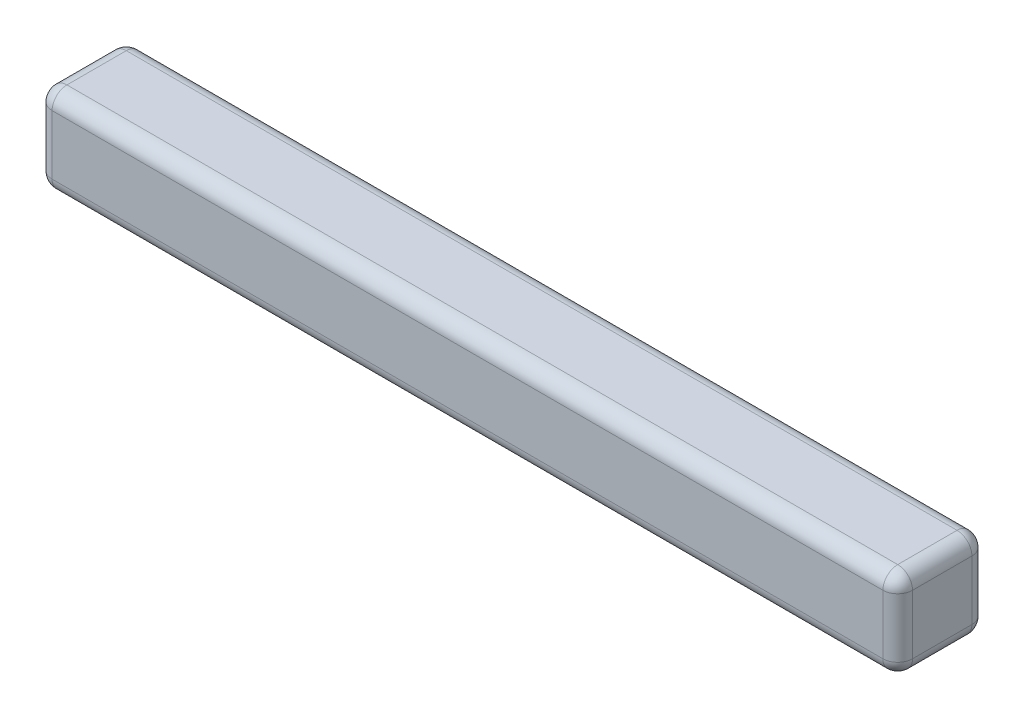
ISO-10303-21;
HEADER;
FILE_DESCRIPTION(('STEP AP214'),'2;1');
FILE_NAME('part.step','',(''),(''),'','','');
FILE_SCHEMA(('AUTOMOTIVE_DESIGN { 1 0 10303 214 1 1 1 1 }'));
ENDSEC;
DATA;
#1=APPLICATION_CONTEXT('core data for automotive mechanical design processes');
#2=APPLICATION_PROTOCOL_DEFINITION('international standard','automotive_design',2000,#1);
#3=PRODUCT_CONTEXT('',#1,'mechanical');
#4=PRODUCT('Part','Part','',(#3));
#5=PRODUCT_RELATED_PRODUCT_CATEGORY('part','',(#4));
#6=PRODUCT_DEFINITION_FORMATION('','',#4);
#7=PRODUCT_DEFINITION_CONTEXT('part definition',#1,'design');
#8=PRODUCT_DEFINITION('design','',#6,#7);
#9=PRODUCT_DEFINITION_SHAPE('','',#8);
#10=(LENGTH_UNIT() NAMED_UNIT(*) SI_UNIT(.MILLI.,.METRE.));
#11=(NAMED_UNIT(*) PLANE_ANGLE_UNIT() SI_UNIT($,.RADIAN.));
#12=(NAMED_UNIT(*) SI_UNIT($,.STERADIAN.) SOLID_ANGLE_UNIT());
#13=UNCERTAINTY_MEASURE_WITH_UNIT(LENGTH_MEASURE(1.E-05),#10,'distance_accuracy_value','');
#14=(GEOMETRIC_REPRESENTATION_CONTEXT(3) GLOBAL_UNCERTAINTY_ASSIGNED_CONTEXT((#13)) GLOBAL_UNIT_ASSIGNED_CONTEXT((#10,
#11,#12)) REPRESENTATION_CONTEXT('',''));
#15=CARTESIAN_POINT('',(0.,0.,0.));
#16=DIRECTION('',(0.,0.,1.));
#17=DIRECTION('',(1.,0.,0.));
#18=AXIS2_PLACEMENT_3D('',#15,#16,#17);
#19=CARTESIAN_POINT('',(11.4400713575457,0.,0.));
#20=DIRECTION('',(1.,0.,0.));
#21=DIRECTION('',(0.,0.,-1.));
#22=AXIS2_PLACEMENT_3D('',#19,#20,#21);
#23=PLANE('',#22);
#24=DIRECTION('',(0.,0.,-1.));
#25=VECTOR('',#24,1.);
#26=CARTESIAN_POINT('',(11.4400713575457,141.574028512687,0.));
#27=LINE('',#26,#25);
#28=CARTESIAN_POINT('',(11.4400713575457,141.574028512687,37.7935567964381));
#29=VERTEX_POINT('',#28);
#30=CARTESIAN_POINT('',(11.4400713575457,141.574028512687,39.7935567964381));
#31=VERTEX_POINT('',#30);
#32=EDGE_CURVE('E50',#29,#31,#27,.F.);
#33=ORIENTED_EDGE('',*,*,#32,.T.);
#34=DIRECTION('',(0.,-1.,0.));
#35=VECTOR('',#34,1.);
#36=CARTESIAN_POINT('',(11.4400713575457,0.,39.7935567964381));
#37=LINE('',#36,#35);
#38=CARTESIAN_POINT('',(11.4400713575457,143.574028512687,39.7935567964381));
#39=VERTEX_POINT('',#38);
#40=EDGE_CURVE('E11',#31,#39,#37,.F.);
#41=ORIENTED_EDGE('',*,*,#40,.T.);
#42=DIRECTION('',(0.,0.,1.));
#43=VECTOR('',#42,1.);
#44=CARTESIAN_POINT('',(11.4400713575457,143.574028512687,0.));
#45=LINE('',#44,#43);
#46=CARTESIAN_POINT('',(11.4400713575457,143.574028512687,37.7935567964381));
#47=VERTEX_POINT('',#46);
#48=EDGE_CURVE('E201',#39,#47,#45,.F.);
#49=ORIENTED_EDGE('',*,*,#48,.T.);
#50=DIRECTION('',(0.,1.,0.));
#51=VECTOR('',#50,1.);
#52=CARTESIAN_POINT('',(11.4400713575457,0.,37.7935567964381));
#53=LINE('',#52,#51);
#54=EDGE_CURVE('E61',#47,#29,#53,.F.);
#55=ORIENTED_EDGE('',*,*,#54,.T.);
#56=EDGE_LOOP('',(#33,#41,#49,#55));
#57=FACE_BOUND('',#56,.T.);
#58=ADVANCED_FACE('F41',(#57),#23,.F.);
#59=CARTESIAN_POINT('',(44.682712044665,144.074028512687,42.7935567964381));
#60=DIRECTION('',(0.,-1.,0.));
#61=DIRECTION('',(0.,0.,-1.));
#62=AXIS2_PLACEMENT_3D('',#59,#60,#61);
#63=PLANE('',#62);
#64=DIRECTION('',(-1.,0.,0.));
#65=VECTOR('',#64,1.);
#66=CARTESIAN_POINT('',(44.682712044665,144.074028512687,39.7935567964381));
#67=LINE('',#66,#65);
#68=CARTESIAN_POINT('',(11.9400713575457,144.074028512687,39.7935567964381));
#69=VERTEX_POINT('',#68);
#70=CARTESIAN_POINT('',(39.9400713575457,144.074028512687,39.7935567964381));
#71=VERTEX_POINT('',#70);
#72=EDGE_CURVE('E182',#69,#71,#67,.F.);
#73=ORIENTED_EDGE('',*,*,#72,.T.);
#74=DIRECTION('',(0.,0.,-1.));
#75=VECTOR('',#74,1.);
#76=CARTESIAN_POINT('',(39.9400713575457,144.074028512687,42.7935567964381));
#77=LINE('',#76,#75);
#78=CARTESIAN_POINT('',(39.9400713575457,144.074028512687,37.7935567964381));
#79=VERTEX_POINT('',#78);
#80=EDGE_CURVE('E211',#71,#79,#77,.T.);
#81=ORIENTED_EDGE('',*,*,#80,.T.);
#82=DIRECTION('',(-1.,0.,0.));
#83=VECTOR('',#82,1.);
#84=CARTESIAN_POINT('',(44.682712044665,144.074028512687,37.7935567964381));
#85=LINE('',#84,#83);
#86=CARTESIAN_POINT('',(11.9400713575457,144.074028512687,37.7935567964381));
#87=VERTEX_POINT('',#86);
#88=EDGE_CURVE('E251',#79,#87,#85,.T.);
#89=ORIENTED_EDGE('',*,*,#88,.T.);
#90=DIRECTION('',(0.,0.,1.));
#91=VECTOR('',#90,1.);
#92=CARTESIAN_POINT('',(11.9400713575457,144.074028512687,42.7935567964381));
#93=LINE('',#92,#91);
#94=EDGE_CURVE('E213',#87,#69,#93,.T.);
#95=ORIENTED_EDGE('',*,*,#94,.T.);
#96=EDGE_LOOP('',(#73,#81,#89,#95));
#97=FACE_BOUND('',#96,.T.);
#98=ADVANCED_FACE('F258',(#97),#63,.F.);
#99=CARTESIAN_POINT('',(44.682712044665,-16.4259714873127,37.2935567964381));
#100=DIRECTION('',(0.,0.,1.));
#101=DIRECTION('',(1.,0.,0.));
#102=AXIS2_PLACEMENT_3D('',#99,#100,#101);
#103=PLANE('',#102);
#104=DIRECTION('',(-1.,0.,0.));
#105=VECTOR('',#104,1.);
#106=CARTESIAN_POINT('',(44.682712044665,143.574028512687,37.2935567964381));
#107=LINE('',#106,#105);
#108=CARTESIAN_POINT('',(11.9400713575457,143.574028512687,37.2935567964381));
#109=VERTEX_POINT('',#108);
#110=CARTESIAN_POINT('',(39.9400713575457,143.574028512687,37.2935567964381));
#111=VERTEX_POINT('',#110);
#112=EDGE_CURVE('E246',#109,#111,#107,.F.);
#113=ORIENTED_EDGE('',*,*,#112,.T.);
#114=DIRECTION('',(0.,-1.,0.));
#115=VECTOR('',#114,1.);
#116=CARTESIAN_POINT('',(39.9400713575457,-16.4259714873127,37.2935567964381));
#117=LINE('',#116,#115);
#118=CARTESIAN_POINT('',(39.9400713575457,141.574028512687,37.2935567964381));
#119=VERTEX_POINT('',#118);
#120=EDGE_CURVE('E203',#111,#119,#117,.T.);
#121=ORIENTED_EDGE('',*,*,#120,.T.);
#122=DIRECTION('',(-1.,0.,0.));
#123=VECTOR('',#122,1.);
#124=CARTESIAN_POINT('',(44.682712044665,141.574028512687,37.2935567964381));
#125=LINE('',#124,#123);
#126=CARTESIAN_POINT('',(11.9400713575457,141.574028512687,37.2935567964381));
#127=VERTEX_POINT('',#126);
#128=EDGE_CURVE('E249',#119,#127,#125,.T.);
#129=ORIENTED_EDGE('',*,*,#128,.T.);
#130=DIRECTION('',(0.,1.,0.));
#131=VECTOR('',#130,1.);
#132=CARTESIAN_POINT('',(11.9400713575457,-16.4259714873127,37.2935567964381));
#133=LINE('',#132,#131);
#134=EDGE_CURVE('E205',#127,#109,#133,.T.);
#135=ORIENTED_EDGE('',*,*,#134,.T.);
#136=EDGE_LOOP('',(#113,#121,#129,#135));
#137=FACE_BOUND('',#136,.T.);
#138=ADVANCED_FACE('F283',(#137),#103,.F.);
#139=CARTESIAN_POINT('',(44.682712044665,141.074028512687,42.7935567964381));
#140=DIRECTION('',(0.,1.,0.));
#141=DIRECTION('',(0.,0.,1.));
#142=AXIS2_PLACEMENT_3D('',#139,#140,#141);
#143=PLANE('',#142);
#144=DIRECTION('',(-1.,0.,0.));
#145=VECTOR('',#144,1.);
#146=CARTESIAN_POINT('',(44.682712044665,141.074028512687,37.7935567964381));
#147=LINE('',#146,#145);
#148=CARTESIAN_POINT('',(11.9400713575457,141.074028512687,37.7935567964381));
#149=VERTEX_POINT('',#148);
#150=CARTESIAN_POINT('',(39.9400713575457,141.074028512687,37.7935567964381));
#151=VERTEX_POINT('',#150);
#152=EDGE_CURVE('E134',#149,#151,#147,.F.);
#153=ORIENTED_EDGE('',*,*,#152,.T.);
#154=DIRECTION('',(0.,0.,1.));
#155=VECTOR('',#154,1.);
#156=CARTESIAN_POINT('',(39.9400713575457,141.074028512687,42.7935567964381));
#157=LINE('',#156,#155);
#158=CARTESIAN_POINT('',(39.9400713575457,141.074028512687,39.7935567964381));
#159=VERTEX_POINT('',#158);
#160=EDGE_CURVE('E140',#151,#159,#157,.T.);
#161=ORIENTED_EDGE('',*,*,#160,.T.);
#162=DIRECTION('',(-1.,0.,0.));
#163=VECTOR('',#162,1.);
#164=CARTESIAN_POINT('',(44.682712044665,141.074028512687,39.7935567964381));
#165=LINE('',#164,#163);
#166=CARTESIAN_POINT('',(11.9400713575457,141.074028512687,39.7935567964381));
#167=VERTEX_POINT('',#166);
#168=EDGE_CURVE('E136',#159,#167,#165,.T.);
#169=ORIENTED_EDGE('',*,*,#168,.T.);
#170=DIRECTION('',(0.,0.,-1.));
#171=VECTOR('',#170,1.);
#172=CARTESIAN_POINT('',(11.9400713575457,141.074028512687,42.7935567964381));
#173=LINE('',#172,#171);
#174=EDGE_CURVE('E131',#167,#149,#173,.T.);
#175=ORIENTED_EDGE('',*,*,#174,.T.);
#176=EDGE_LOOP('',(#153,#161,#169,#175));
#177=FACE_BOUND('',#176,.T.);
#178=ADVANCED_FACE('F133',(#177),#143,.F.);
#179=CARTESIAN_POINT('',(44.682712044665,-16.4259714873127,40.2935567964381));
#180=DIRECTION('',(0.,0.,-1.));
#181=DIRECTION('',(-1.,0.,0.));
#182=AXIS2_PLACEMENT_3D('',#179,#180,#181);
#183=PLANE('',#182);
#184=DIRECTION('',(-1.,0.,0.));
#185=VECTOR('',#184,1.);
#186=CARTESIAN_POINT('',(44.682712044665,141.574028512687,40.2935567964381));
#187=LINE('',#186,#185);
#188=CARTESIAN_POINT('',(11.9400713575457,141.574028512687,40.2935567964381));
#189=VERTEX_POINT('',#188);
#190=CARTESIAN_POINT('',(39.9400713575457,141.574028512687,40.2935567964381));
#191=VERTEX_POINT('',#190);
#192=EDGE_CURVE('E243',#189,#191,#187,.F.);
#193=ORIENTED_EDGE('',*,*,#192,.T.);
#194=DIRECTION('',(0.,1.,0.));
#195=VECTOR('',#194,1.);
#196=CARTESIAN_POINT('',(39.9400713575457,-16.4259714873127,40.2935567964381));
#197=LINE('',#196,#195);
#198=CARTESIAN_POINT('',(39.9400713575457,143.574028512687,40.2935567964381));
#199=VERTEX_POINT('',#198);
#200=EDGE_CURVE('E220',#191,#199,#197,.T.);
#201=ORIENTED_EDGE('',*,*,#200,.T.);
#202=DIRECTION('',(-1.,0.,0.));
#203=VECTOR('',#202,1.);
#204=CARTESIAN_POINT('',(44.682712044665,143.574028512687,40.2935567964381));
#205=LINE('',#204,#203);
#206=CARTESIAN_POINT('',(11.9400713575457,143.574028512687,40.2935567964381));
#207=VERTEX_POINT('',#206);
#208=EDGE_CURVE('E240',#199,#207,#205,.T.);
#209=ORIENTED_EDGE('',*,*,#208,.T.);
#210=DIRECTION('',(0.,-1.,0.));
#211=VECTOR('',#210,1.);
#212=CARTESIAN_POINT('',(11.9400713575457,-16.4259714873127,40.2935567964381));
#213=LINE('',#212,#211);
#214=EDGE_CURVE('E222',#207,#189,#213,.T.);
#215=ORIENTED_EDGE('',*,*,#214,.T.);
#216=EDGE_LOOP('',(#193,#201,#209,#215));
#217=FACE_BOUND('',#216,.T.);
#218=ADVANCED_FACE('F305',(#217),#183,.F.);
#219=CARTESIAN_POINT('',(40.4400713575457,-16.4259714873127,42.7935567964381));
#220=DIRECTION('',(-1.,0.,0.));
#221=DIRECTION('',(0.,0.,1.));
#222=AXIS2_PLACEMENT_3D('',#219,#220,#221);
#223=PLANE('',#222);
#224=DIRECTION('',(0.,1.,0.));
#225=VECTOR('',#224,1.);
#226=CARTESIAN_POINT('',(40.4400713575457,-16.4259714873127,39.7935567964381));
#227=LINE('',#226,#225);
#228=CARTESIAN_POINT('',(40.4400713575457,143.574028512687,39.7935567964381));
#229=VERTEX_POINT('',#228);
#230=CARTESIAN_POINT('',(40.4400713575457,141.574028512687,39.7935567964381));
#231=VERTEX_POINT('',#230);
#232=EDGE_CURVE('E231',#229,#231,#227,.F.);
#233=ORIENTED_EDGE('',*,*,#232,.T.);
#234=DIRECTION('',(0.,0.,1.));
#235=VECTOR('',#234,1.);
#236=CARTESIAN_POINT('',(40.4400713575457,141.574028512687,42.7935567964381));
#237=LINE('',#236,#235);
#238=CARTESIAN_POINT('',(40.4400713575457,141.574028512687,37.7935567964381));
#239=VERTEX_POINT('',#238);
#240=EDGE_CURVE('E228',#231,#239,#237,.F.);
#241=ORIENTED_EDGE('',*,*,#240,.T.);
#242=DIRECTION('',(0.,-1.,0.));
#243=VECTOR('',#242,1.);
#244=CARTESIAN_POINT('',(40.4400713575457,-16.4259714873127,37.7935567964381));
#245=LINE('',#244,#243);
#246=CARTESIAN_POINT('',(40.4400713575457,143.574028512687,37.7935567964381));
#247=VERTEX_POINT('',#246);
#248=EDGE_CURVE('E235',#239,#247,#245,.F.);
#249=ORIENTED_EDGE('',*,*,#248,.T.);
#250=DIRECTION('',(0.,0.,-1.));
#251=VECTOR('',#250,1.);
#252=CARTESIAN_POINT('',(40.4400713575457,143.574028512687,42.7935567964381));
#253=LINE('',#252,#251);
#254=EDGE_CURVE('E233',#247,#229,#253,.F.);
#255=ORIENTED_EDGE('',*,*,#254,.T.);
#256=EDGE_LOOP('',(#233,#241,#249,#255));
#257=FACE_BOUND('',#256,.T.);
#258=ADVANCED_FACE('F321',(#257),#223,.F.);
#259=CARTESIAN_POINT('',(44.682712044665,143.574028512687,37.7935567964381));
#260=DIRECTION('',(-1.,0.,0.));
#261=DIRECTION('',(0.,0.,1.));
#262=AXIS2_PLACEMENT_3D('',#259,#260,#261);
#263=CYLINDRICAL_SURFACE('',#262,0.5);
#264=ORIENTED_EDGE('',*,*,#88,.F.);
#265=CARTESIAN_POINT('',(39.9400713575457,143.574028512687,37.7935567964381));
#266=DIRECTION('',(-1.,0.,0.));
#267=DIRECTION('',(0.,0.,1.));
#268=AXIS2_PLACEMENT_3D('',#265,#266,#267);
#269=CIRCLE('',#268,0.5);
#270=EDGE_CURVE('E207',#79,#111,#269,.T.);
#271=ORIENTED_EDGE('',*,*,#270,.T.);
#272=ORIENTED_EDGE('',*,*,#112,.F.);
#273=CARTESIAN_POINT('',(11.9400713575457,143.574028512687,37.7935567964381));
#274=DIRECTION('',(-1.,0.,0.));
#275=DIRECTION('',(0.,0.,1.));
#276=AXIS2_PLACEMENT_3D('',#273,#274,#275);
#277=CIRCLE('',#276,0.5);
#278=EDGE_CURVE('E209',#109,#87,#277,.F.);
#279=ORIENTED_EDGE('',*,*,#278,.T.);
#280=EDGE_LOOP('',(#264,#271,#272,#279));
#281=FACE_BOUND('',#280,.T.);
#282=ADVANCED_FACE('F280',(#281),#263,.T.);
#283=CARTESIAN_POINT('',(44.682712044665,143.574028512687,39.7935567964381));
#284=DIRECTION('',(-1.,0.,0.));
#285=DIRECTION('',(0.,0.,1.));
#286=AXIS2_PLACEMENT_3D('',#283,#284,#285);
#287=CYLINDRICAL_SURFACE('',#286,0.5);
#288=ORIENTED_EDGE('',*,*,#208,.F.);
#289=CARTESIAN_POINT('',(39.9400713575457,143.574028512687,39.7935567964381));
#290=DIRECTION('',(-1.,0.,0.));
#291=DIRECTION('',(0.,0.,1.));
#292=AXIS2_PLACEMENT_3D('',#289,#290,#291);
#293=CIRCLE('',#292,0.5);
#294=EDGE_CURVE('E215',#199,#71,#293,.T.);
#295=ORIENTED_EDGE('',*,*,#294,.T.);
#296=ORIENTED_EDGE('',*,*,#72,.F.);
#297=CARTESIAN_POINT('',(11.9400713575457,143.574028512687,39.7935567964381));
#298=DIRECTION('',(-1.,0.,0.));
#299=DIRECTION('',(0.,0.,1.));
#300=AXIS2_PLACEMENT_3D('',#297,#298,#299);
#301=CIRCLE('',#300,0.5);
#302=EDGE_CURVE('E217',#69,#207,#301,.F.);
#303=ORIENTED_EDGE('',*,*,#302,.T.);
#304=EDGE_LOOP('',(#288,#295,#296,#303));
#305=FACE_BOUND('',#304,.T.);
#306=ADVANCED_FACE('F304',(#305),#287,.T.);
#307=CARTESIAN_POINT('',(44.682712044665,141.574028512687,37.7935567964381));
#308=DIRECTION('',(-1.,0.,0.));
#309=DIRECTION('',(0.,0.,1.));
#310=AXIS2_PLACEMENT_3D('',#307,#308,#309);
#311=CYLINDRICAL_SURFACE('',#310,0.5);
#312=ORIENTED_EDGE('',*,*,#128,.F.);
#313=CARTESIAN_POINT('',(39.9400713575457,141.574028512687,37.7935567964381));
#314=DIRECTION('',(-1.,0.,0.));
#315=DIRECTION('',(0.,0.,1.));
#316=AXIS2_PLACEMENT_3D('',#313,#314,#315);
#317=CIRCLE('',#316,0.5);
#318=EDGE_CURVE('E141',#119,#151,#317,.T.);
#319=ORIENTED_EDGE('',*,*,#318,.T.);
#320=ORIENTED_EDGE('',*,*,#152,.F.);
#321=CARTESIAN_POINT('',(11.9400713575457,141.574028512687,37.7935567964381));
#322=DIRECTION('',(-1.,0.,0.));
#323=DIRECTION('',(0.,0.,1.));
#324=AXIS2_PLACEMENT_3D('',#321,#322,#323);
#325=CIRCLE('',#324,0.5);
#326=EDGE_CURVE('E148',#149,#127,#325,.F.);
#327=ORIENTED_EDGE('',*,*,#326,.T.);
#328=EDGE_LOOP('',(#312,#319,#320,#327));
#329=FACE_BOUND('',#328,.T.);
#330=ADVANCED_FACE('F147',(#329),#311,.T.);
#331=CARTESIAN_POINT('',(44.682712044665,141.574028512687,39.7935567964381));
#332=DIRECTION('',(-1.,0.,0.));
#333=DIRECTION('',(0.,0.,1.));
#334=AXIS2_PLACEMENT_3D('',#331,#332,#333);
#335=CYLINDRICAL_SURFACE('',#334,0.5);
#336=ORIENTED_EDGE('',*,*,#168,.F.);
#337=CARTESIAN_POINT('',(39.9400713575457,141.574028512687,39.7935567964381));
#338=DIRECTION('',(-1.,0.,0.));
#339=DIRECTION('',(0.,0.,1.));
#340=AXIS2_PLACEMENT_3D('',#337,#338,#339);
#341=CIRCLE('',#340,0.5);
#342=EDGE_CURVE('E224',#159,#191,#341,.T.);
#343=ORIENTED_EDGE('',*,*,#342,.T.);
#344=ORIENTED_EDGE('',*,*,#192,.F.);
#345=CARTESIAN_POINT('',(11.9400713575457,141.574028512687,39.7935567964381));
#346=DIRECTION('',(-1.,0.,0.));
#347=DIRECTION('',(0.,0.,1.));
#348=AXIS2_PLACEMENT_3D('',#345,#346,#347);
#349=CIRCLE('',#348,0.5);
#350=EDGE_CURVE('E226',#189,#167,#349,.F.);
#351=ORIENTED_EDGE('',*,*,#350,.T.);
#352=EDGE_LOOP('',(#336,#343,#344,#351));
#353=FACE_BOUND('',#352,.T.);
#354=ADVANCED_FACE('F328',(#353),#335,.T.);
#355=CARTESIAN_POINT('',(39.9400713575457,143.574028512687,39.7935567964381));
#356=DIRECTION('',(-1.,0.,0.));
#357=DIRECTION('',(0.,0.,1.));
#358=AXIS2_PLACEMENT_3D('',#355,#356,#357);
#359=SPHERICAL_SURFACE('',#358,0.5);
#360=CARTESIAN_POINT('',(39.9400713575457,143.574028512687,39.7935567964381));
#361=DIRECTION('',(0.,0.,-1.));
#362=DIRECTION('',(-1.,0.,0.));
#363=AXIS2_PLACEMENT_3D('',#360,#361,#362);
#364=CIRCLE('',#363,0.5);
#365=EDGE_CURVE('E183',#71,#229,#364,.T.);
#366=ORIENTED_EDGE('',*,*,#365,.F.);
#367=ORIENTED_EDGE('',*,*,#294,.F.);
#368=CARTESIAN_POINT('',(39.9400713575457,143.574028512687,39.7935567964381));
#369=DIRECTION('',(0.,-1.,0.));
#370=DIRECTION('',(0.,0.,-1.));
#371=AXIS2_PLACEMENT_3D('',#368,#369,#370);
#372=CIRCLE('',#371,0.5);
#373=EDGE_CURVE('E179',#229,#199,#372,.T.);
#374=ORIENTED_EDGE('',*,*,#373,.F.);
#375=EDGE_LOOP('',(#366,#367,#374));
#376=FACE_BOUND('',#375,.T.);
#377=ADVANCED_FACE('F267',(#376),#359,.T.);
#378=CARTESIAN_POINT('',(39.9400713575457,-16.4259714873127,39.7935567964381));
#379=DIRECTION('',(0.,1.,0.));
#380=DIRECTION('',(0.,0.,1.));
#381=AXIS2_PLACEMENT_3D('',#378,#379,#380);
#382=CYLINDRICAL_SURFACE('',#381,0.5);
#383=ORIENTED_EDGE('',*,*,#373,.T.);
#384=ORIENTED_EDGE('',*,*,#200,.F.);
#385=CARTESIAN_POINT('',(39.9400713575457,141.574028512687,39.7935567964381));
#386=DIRECTION('',(0.,-1.,0.));
#387=DIRECTION('',(0.,0.,-1.));
#388=AXIS2_PLACEMENT_3D('',#385,#386,#387);
#389=CIRCLE('',#388,0.5);
#390=EDGE_CURVE('E186',#231,#191,#389,.T.);
#391=ORIENTED_EDGE('',*,*,#390,.F.);
#392=ORIENTED_EDGE('',*,*,#232,.F.);
#393=EDGE_LOOP('',(#383,#384,#391,#392));
#394=FACE_BOUND('',#393,.T.);
#395=ADVANCED_FACE('F309',(#394),#382,.T.);
#396=CARTESIAN_POINT('',(39.9400713575457,143.574028512687,42.7935567964381));
#397=DIRECTION('',(0.,0.,-1.));
#398=DIRECTION('',(-1.,0.,0.));
#399=AXIS2_PLACEMENT_3D('',#396,#397,#398);
#400=CYLINDRICAL_SURFACE('',#399,0.5);
#401=ORIENTED_EDGE('',*,*,#365,.T.);
#402=ORIENTED_EDGE('',*,*,#254,.F.);
#403=CARTESIAN_POINT('',(39.9400713575457,143.574028512687,37.7935567964381));
#404=DIRECTION('',(0.,0.,-1.));
#405=DIRECTION('',(-1.,0.,0.));
#406=AXIS2_PLACEMENT_3D('',#403,#404,#405);
#407=CIRCLE('',#406,0.5);
#408=EDGE_CURVE('E189',#79,#247,#407,.T.);
#409=ORIENTED_EDGE('',*,*,#408,.F.);
#410=ORIENTED_EDGE('',*,*,#80,.F.);
#411=EDGE_LOOP('',(#401,#402,#409,#410));
#412=FACE_BOUND('',#411,.T.);
#413=ADVANCED_FACE('F272',(#412),#400,.T.);
#414=CARTESIAN_POINT('',(39.9400713575457,141.574028512687,39.7935567964381));
#415=DIRECTION('',(-1.,0.,0.));
#416=DIRECTION('',(0.,0.,1.));
#417=AXIS2_PLACEMENT_3D('',#414,#415,#416);
#418=SPHERICAL_SURFACE('',#417,0.5);
#419=ORIENTED_EDGE('',*,*,#390,.T.);
#420=ORIENTED_EDGE('',*,*,#342,.F.);
#421=CARTESIAN_POINT('',(39.9400713575457,141.574028512687,39.7935567964381));
#422=DIRECTION('',(0.,0.,-1.));
#423=DIRECTION('',(-1.,0.,0.));
#424=AXIS2_PLACEMENT_3D('',#421,#422,#423);
#425=CIRCLE('',#424,0.5);
#426=EDGE_CURVE('E192',#231,#159,#425,.T.);
#427=ORIENTED_EDGE('',*,*,#426,.F.);
#428=EDGE_LOOP('',(#419,#420,#427));
#429=FACE_BOUND('',#428,.T.);
#430=ADVANCED_FACE('F313',(#429),#418,.T.);
#431=CARTESIAN_POINT('',(39.9400713575457,143.574028512687,37.7935567964381));
#432=DIRECTION('',(-1.,0.,0.));
#433=DIRECTION('',(0.,0.,1.));
#434=AXIS2_PLACEMENT_3D('',#431,#432,#433);
#435=SPHERICAL_SURFACE('',#434,0.5);
#436=ORIENTED_EDGE('',*,*,#270,.F.);
#437=ORIENTED_EDGE('',*,*,#408,.T.);
#438=CARTESIAN_POINT('',(39.9400713575457,143.574028512687,37.7935567964381));
#439=DIRECTION('',(0.,-1.,0.));
#440=DIRECTION('',(0.,0.,-1.));
#441=AXIS2_PLACEMENT_3D('',#438,#439,#440);
#442=CIRCLE('',#441,0.5);
#443=EDGE_CURVE('E195',#111,#247,#442,.T.);
#444=ORIENTED_EDGE('',*,*,#443,.F.);
#445=EDGE_LOOP('',(#436,#437,#444));
#446=FACE_BOUND('',#445,.T.);
#447=ADVANCED_FACE('F276',(#446),#435,.T.);
#448=CARTESIAN_POINT('',(39.9400713575457,141.574028512687,42.7935567964381));
#449=DIRECTION('',(0.,0.,1.));
#450=DIRECTION('',(1.,0.,0.));
#451=AXIS2_PLACEMENT_3D('',#448,#449,#450);
#452=CYLINDRICAL_SURFACE('',#451,0.5);
#453=ORIENTED_EDGE('',*,*,#426,.T.);
#454=ORIENTED_EDGE('',*,*,#160,.F.);
#455=CARTESIAN_POINT('',(39.9400713575457,141.574028512687,37.7935567964381));
#456=DIRECTION('',(0.,0.,-1.));
#457=DIRECTION('',(-1.,0.,0.));
#458=AXIS2_PLACEMENT_3D('',#455,#456,#457);
#459=CIRCLE('',#458,0.5);
#460=EDGE_CURVE('E160',#239,#151,#459,.T.);
#461=ORIENTED_EDGE('',*,*,#460,.F.);
#462=ORIENTED_EDGE('',*,*,#240,.F.);
#463=EDGE_LOOP('',(#453,#454,#461,#462));
#464=FACE_BOUND('',#463,.T.);
#465=ADVANCED_FACE('F318',(#464),#452,.T.);
#466=CARTESIAN_POINT('',(39.9400713575457,-16.4259714873127,37.7935567964381));
#467=DIRECTION('',(0.,-1.,0.));
#468=DIRECTION('',(0.,0.,-1.));
#469=AXIS2_PLACEMENT_3D('',#466,#467,#468);
#470=CYLINDRICAL_SURFACE('',#469,0.5);
#471=ORIENTED_EDGE('',*,*,#443,.T.);
#472=ORIENTED_EDGE('',*,*,#248,.F.);
#473=CARTESIAN_POINT('',(39.9400713575457,141.574028512687,37.7935567964381));
#474=DIRECTION('',(0.,-1.,0.));
#475=DIRECTION('',(0.,0.,-1.));
#476=AXIS2_PLACEMENT_3D('',#473,#474,#475);
#477=CIRCLE('',#476,0.5);
#478=EDGE_CURVE('E159',#119,#239,#477,.T.);
#479=ORIENTED_EDGE('',*,*,#478,.F.);
#480=ORIENTED_EDGE('',*,*,#120,.F.);
#481=EDGE_LOOP('',(#471,#472,#479,#480));
#482=FACE_BOUND('',#481,.T.);
#483=ADVANCED_FACE('F324',(#482),#470,.T.);
#484=CARTESIAN_POINT('',(39.9400713575457,141.574028512687,37.7935567964381));
#485=DIRECTION('',(-1.,0.,0.));
#486=DIRECTION('',(0.,0.,1.));
#487=AXIS2_PLACEMENT_3D('',#484,#485,#486);
#488=SPHERICAL_SURFACE('',#487,0.5);
#489=ORIENTED_EDGE('',*,*,#460,.T.);
#490=ORIENTED_EDGE('',*,*,#318,.F.);
#491=ORIENTED_EDGE('',*,*,#478,.T.);
#492=EDGE_LOOP('',(#489,#490,#491));
#493=FACE_BOUND('',#492,.T.);
#494=ADVANCED_FACE('F326',(#493),#488,.T.);
#495=CARTESIAN_POINT('',(11.9400713575457,141.574028512687,37.7935567964381));
#496=DIRECTION('',(1.,0.,0.));
#497=DIRECTION('',(0.,0.,-1.));
#498=AXIS2_PLACEMENT_3D('',#495,#496,#497);
#499=SPHERICAL_SURFACE('',#498,0.5);
#500=CARTESIAN_POINT('',(11.9400713575457,141.574028512687,37.7935567964381));
#501=DIRECTION('',(0.,1.,0.));
#502=DIRECTION('',(0.,0.,1.));
#503=AXIS2_PLACEMENT_3D('',#500,#501,#502);
#504=CIRCLE('',#503,0.5);
#505=EDGE_CURVE('E155',#127,#29,#504,.T.);
#506=ORIENTED_EDGE('',*,*,#505,.F.);
#507=ORIENTED_EDGE('',*,*,#326,.F.);
#508=CARTESIAN_POINT('',(11.9400713575457,141.574028512687,37.7935567964381));
#509=DIRECTION('',(0.,0.,1.));
#510=DIRECTION('',(1.,0.,0.));
#511=AXIS2_PLACEMENT_3D('',#508,#509,#510);
#512=CIRCLE('',#511,0.5);
#513=EDGE_CURVE('E45',#29,#149,#512,.T.);
#514=ORIENTED_EDGE('',*,*,#513,.F.);
#515=EDGE_LOOP('',(#506,#507,#514));
#516=FACE_BOUND('',#515,.T.);
#517=ADVANCED_FACE('F43',(#516),#499,.T.);
#518=CARTESIAN_POINT('',(11.9400713575457,141.574028512687,42.7935567964381));
#519=DIRECTION('',(0.,0.,-1.));
#520=DIRECTION('',(-1.,0.,0.));
#521=AXIS2_PLACEMENT_3D('',#518,#519,#520);
#522=CYLINDRICAL_SURFACE('',#521,0.5);
#523=ORIENTED_EDGE('',*,*,#513,.T.);
#524=ORIENTED_EDGE('',*,*,#174,.F.);
#525=CARTESIAN_POINT('',(11.9400713575457,141.574028512687,39.7935567964381));
#526=DIRECTION('',(0.,0.,1.));
#527=DIRECTION('',(1.,0.,0.));
#528=AXIS2_PLACEMENT_3D('',#525,#526,#527);
#529=CIRCLE('',#528,0.5);
#530=EDGE_CURVE('E162',#31,#167,#529,.T.);
#531=ORIENTED_EDGE('',*,*,#530,.F.);
#532=ORIENTED_EDGE('',*,*,#32,.F.);
#533=EDGE_LOOP('',(#523,#524,#531,#532));
#534=FACE_BOUND('',#533,.T.);
#535=ADVANCED_FACE('F158',(#534),#522,.T.);
#536=CARTESIAN_POINT('',(11.9400713575457,-16.4259714873127,37.7935567964381));
#537=DIRECTION('',(0.,1.,0.));
#538=DIRECTION('',(0.,0.,1.));
#539=AXIS2_PLACEMENT_3D('',#536,#537,#538);
#540=CYLINDRICAL_SURFACE('',#539,0.5);
#541=ORIENTED_EDGE('',*,*,#505,.T.);
#542=ORIENTED_EDGE('',*,*,#54,.F.);
#543=CARTESIAN_POINT('',(11.9400713575457,143.574028512687,37.7935567964381));
#544=DIRECTION('',(0.,1.,0.));
#545=DIRECTION('',(0.,0.,1.));
#546=AXIS2_PLACEMENT_3D('',#543,#544,#545);
#547=CIRCLE('',#546,0.5);
#548=EDGE_CURVE('E164',#109,#47,#547,.T.);
#549=ORIENTED_EDGE('',*,*,#548,.F.);
#550=ORIENTED_EDGE('',*,*,#134,.F.);
#551=EDGE_LOOP('',(#541,#542,#549,#550));
#552=FACE_BOUND('',#551,.T.);
#553=ADVANCED_FACE('F284',(#552),#540,.T.);
#554=CARTESIAN_POINT('',(11.9400713575457,141.574028512687,39.7935567964381));
#555=DIRECTION('',(1.,0.,0.));
#556=DIRECTION('',(0.,0.,-1.));
#557=AXIS2_PLACEMENT_3D('',#554,#555,#556);
#558=SPHERICAL_SURFACE('',#557,0.5);
#559=ORIENTED_EDGE('',*,*,#530,.T.);
#560=ORIENTED_EDGE('',*,*,#350,.F.);
#561=CARTESIAN_POINT('',(11.9400713575457,141.574028512687,39.7935567964381));
#562=DIRECTION('',(0.,1.,0.));
#563=DIRECTION('',(0.,0.,1.));
#564=AXIS2_PLACEMENT_3D('',#561,#562,#563);
#565=CIRCLE('',#564,0.5);
#566=EDGE_CURVE('E169',#31,#189,#565,.T.);
#567=ORIENTED_EDGE('',*,*,#566,.F.);
#568=EDGE_LOOP('',(#559,#560,#567));
#569=FACE_BOUND('',#568,.T.);
#570=ADVANCED_FACE('F331',(#569),#558,.T.);
#571=CARTESIAN_POINT('',(11.9400713575457,143.574028512687,37.7935567964381));
#572=DIRECTION('',(1.,0.,0.));
#573=DIRECTION('',(0.,0.,-1.));
#574=AXIS2_PLACEMENT_3D('',#571,#572,#573);
#575=SPHERICAL_SURFACE('',#574,0.5);
#576=ORIENTED_EDGE('',*,*,#278,.F.);
#577=ORIENTED_EDGE('',*,*,#548,.T.);
#578=CARTESIAN_POINT('',(11.9400713575457,143.574028512687,37.7935567964381));
#579=DIRECTION('',(0.,0.,1.));
#580=DIRECTION('',(1.,0.,0.));
#581=AXIS2_PLACEMENT_3D('',#578,#579,#580);
#582=CIRCLE('',#581,0.5);
#583=EDGE_CURVE('E172',#87,#47,#582,.T.);
#584=ORIENTED_EDGE('',*,*,#583,.F.);
#585=EDGE_LOOP('',(#576,#577,#584));
#586=FACE_BOUND('',#585,.T.);
#587=ADVANCED_FACE('F288',(#586),#575,.T.);
#588=CARTESIAN_POINT('',(11.9400713575457,-16.4259714873127,39.7935567964381));
#589=DIRECTION('',(0.,-1.,0.));
#590=DIRECTION('',(0.,0.,-1.));
#591=AXIS2_PLACEMENT_3D('',#588,#589,#590);
#592=CYLINDRICAL_SURFACE('',#591,0.5);
#593=ORIENTED_EDGE('',*,*,#566,.T.);
#594=ORIENTED_EDGE('',*,*,#214,.F.);
#595=CARTESIAN_POINT('',(11.9400713575457,143.574028512687,39.7935567964381));
#596=DIRECTION('',(0.,1.,0.));
#597=DIRECTION('',(0.,0.,1.));
#598=AXIS2_PLACEMENT_3D('',#595,#596,#597);
#599=CIRCLE('',#598,0.5);
#600=EDGE_CURVE('E175',#39,#207,#599,.T.);
#601=ORIENTED_EDGE('',*,*,#600,.F.);
#602=ORIENTED_EDGE('',*,*,#40,.F.);
#603=EDGE_LOOP('',(#593,#594,#601,#602));
#604=FACE_BOUND('',#603,.T.);
#605=ADVANCED_FACE('F299',(#604),#592,.T.);
#606=CARTESIAN_POINT('',(11.9400713575457,143.574028512687,42.7935567964381));
#607=DIRECTION('',(0.,0.,1.));
#608=DIRECTION('',(1.,0.,0.));
#609=AXIS2_PLACEMENT_3D('',#606,#607,#608);
#610=CYLINDRICAL_SURFACE('',#609,0.5);
#611=ORIENTED_EDGE('',*,*,#583,.T.);
#612=ORIENTED_EDGE('',*,*,#48,.F.);
#613=CARTESIAN_POINT('',(11.9400713575457,143.574028512687,39.7935567964381));
#614=DIRECTION('',(0.,0.,1.));
#615=DIRECTION('',(1.,0.,0.));
#616=AXIS2_PLACEMENT_3D('',#613,#614,#615);
#617=CIRCLE('',#616,0.5);
#618=EDGE_CURVE('E177',#69,#39,#617,.T.);
#619=ORIENTED_EDGE('',*,*,#618,.F.);
#620=ORIENTED_EDGE('',*,*,#94,.F.);
#621=EDGE_LOOP('',(#611,#612,#619,#620));
#622=FACE_BOUND('',#621,.T.);
#623=ADVANCED_FACE('F292',(#622),#610,.T.);
#624=CARTESIAN_POINT('',(11.9400713575457,143.574028512687,39.7935567964381));
#625=DIRECTION('',(1.,0.,0.));
#626=DIRECTION('',(0.,0.,-1.));
#627=AXIS2_PLACEMENT_3D('',#624,#625,#626);
#628=SPHERICAL_SURFACE('',#627,0.5);
#629=ORIENTED_EDGE('',*,*,#600,.T.);
#630=ORIENTED_EDGE('',*,*,#302,.F.);
#631=ORIENTED_EDGE('',*,*,#618,.T.);
#632=EDGE_LOOP('',(#629,#630,#631));
#633=FACE_BOUND('',#632,.T.);
#634=ADVANCED_FACE('F295',(#633),#628,.T.);
#635=CLOSED_SHELL('',(#58,#98,#138,#178,#218,#258,#282,#306,#330,#354,#377,#395,#413,#430,#447,
#465,#483,#494,#517,#535,#553,#570,#587,#605,#623,#634));
#636=MANIFOLD_SOLID_BREP('B2',#635);
#637=ADVANCED_BREP_SHAPE_REPRESENTATION('',(#18,#636),#14);
#638=SHAPE_DEFINITION_REPRESENTATION(#9,#637);
ENDSEC;
END-ISO-10303-21;
